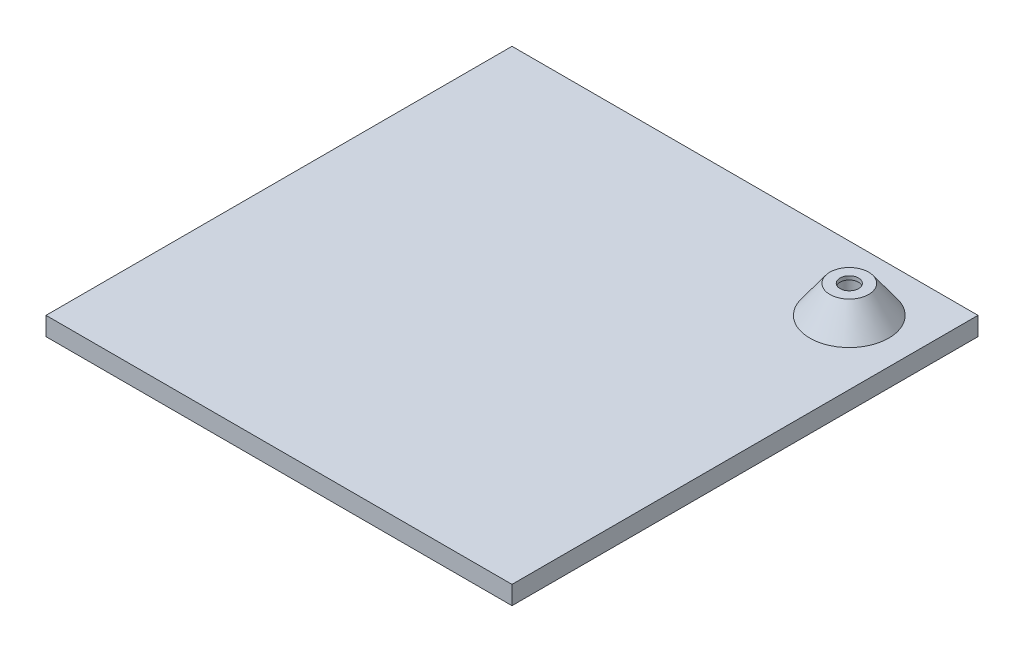
ISO-10303-21;
HEADER;
FILE_DESCRIPTION(('STEP AP214'),'2;1');
FILE_NAME('part.step','',(''),(''),'','','');
FILE_SCHEMA(('AUTOMOTIVE_DESIGN { 1 0 10303 214 1 1 1 1 }'));
ENDSEC;
DATA;
#1=APPLICATION_CONTEXT('core data for automotive mechanical design processes');
#2=APPLICATION_PROTOCOL_DEFINITION('international standard','automotive_design',2000,#1);
#3=PRODUCT_CONTEXT('',#1,'mechanical');
#4=PRODUCT('Part','Part','',(#3));
#5=PRODUCT_RELATED_PRODUCT_CATEGORY('part','',(#4));
#6=PRODUCT_DEFINITION_FORMATION('','',#4);
#7=PRODUCT_DEFINITION_CONTEXT('part definition',#1,'design');
#8=PRODUCT_DEFINITION('design','',#6,#7);
#9=PRODUCT_DEFINITION_SHAPE('','',#8);
#10=(LENGTH_UNIT() NAMED_UNIT(*) SI_UNIT(.MILLI.,.METRE.));
#11=(NAMED_UNIT(*) PLANE_ANGLE_UNIT() SI_UNIT($,.RADIAN.));
#12=(NAMED_UNIT(*) SI_UNIT($,.STERADIAN.) SOLID_ANGLE_UNIT());
#13=UNCERTAINTY_MEASURE_WITH_UNIT(LENGTH_MEASURE(1.E-05),#10,'distance_accuracy_value','');
#14=(GEOMETRIC_REPRESENTATION_CONTEXT(3) GLOBAL_UNCERTAINTY_ASSIGNED_CONTEXT((#13)) GLOBAL_UNIT_ASSIGNED_CONTEXT((#10,
#11,#12)) REPRESENTATION_CONTEXT('',''));
#15=CARTESIAN_POINT('',(0.,0.,0.));
#16=DIRECTION('',(0.,0.,1.));
#17=DIRECTION('',(1.,0.,0.));
#18=AXIS2_PLACEMENT_3D('',#15,#16,#17);
#19=CARTESIAN_POINT('',(0.,5.,0.));
#20=DIRECTION('',(1.,0.,0.));
#21=DIRECTION('',(0.,0.,-1.));
#22=AXIS2_PLACEMENT_3D('',#19,#20,#21);
#23=PLANE('',#22);
#24=DIRECTION('',(0.,0.,1.));
#25=VECTOR('',#24,1.);
#26=CARTESIAN_POINT('',(0.,0.,0.));
#27=LINE('',#26,#25);
#28=CARTESIAN_POINT('',(0.,0.,-126.));
#29=VERTEX_POINT('',#28);
#30=CARTESIAN_POINT('',(0.,0.,0.));
#31=VERTEX_POINT('',#30);
#32=EDGE_CURVE('E115',#29,#31,#27,.T.);
#33=ORIENTED_EDGE('',*,*,#32,.T.);
#34=DIRECTION('',(0.,-1.,0.));
#35=VECTOR('',#34,1.);
#36=CARTESIAN_POINT('',(0.,5.,0.));
#37=LINE('',#36,#35);
#38=CARTESIAN_POINT('',(0.,5.,0.));
#39=VERTEX_POINT('',#38);
#40=EDGE_CURVE('E104',#39,#31,#37,.T.);
#41=ORIENTED_EDGE('',*,*,#40,.F.);
#42=DIRECTION('',(0.,0.,1.));
#43=VECTOR('',#42,1.);
#44=CARTESIAN_POINT('',(0.,5.,0.));
#45=LINE('',#44,#43);
#46=CARTESIAN_POINT('',(0.,5.,-126.));
#47=VERTEX_POINT('',#46);
#48=EDGE_CURVE('E96',#47,#39,#45,.T.);
#49=ORIENTED_EDGE('',*,*,#48,.F.);
#50=DIRECTION('',(0.,-1.,0.));
#51=VECTOR('',#50,1.);
#52=CARTESIAN_POINT('',(0.,5.,-126.));
#53=LINE('',#52,#51);
#54=EDGE_CURVE('E111',#47,#29,#53,.T.);
#55=ORIENTED_EDGE('',*,*,#54,.T.);
#56=EDGE_LOOP('',(#33,#41,#49,#55));
#57=FACE_BOUND('',#56,.T.);
#58=ADVANCED_FACE('F41',(#57),#23,.F.);
#59=CARTESIAN_POINT('',(0.,5.,0.));
#60=DIRECTION('',(0.,0.,-1.));
#61=DIRECTION('',(-1.,0.,0.));
#62=AXIS2_PLACEMENT_3D('',#59,#60,#61);
#63=PLANE('',#62);
#64=DIRECTION('',(1.,0.,0.));
#65=VECTOR('',#64,1.);
#66=CARTESIAN_POINT('',(0.,0.,0.));
#67=LINE('',#66,#65);
#68=CARTESIAN_POINT('',(126.,0.,0.));
#69=VERTEX_POINT('',#68);
#70=EDGE_CURVE('E102',#31,#69,#67,.T.);
#71=ORIENTED_EDGE('',*,*,#70,.T.);
#72=DIRECTION('',(0.,-1.,0.));
#73=VECTOR('',#72,1.);
#74=CARTESIAN_POINT('',(126.,5.,0.));
#75=LINE('',#74,#73);
#76=CARTESIAN_POINT('',(126.,5.,0.));
#77=VERTEX_POINT('',#76);
#78=EDGE_CURVE('E100',#77,#69,#75,.T.);
#79=ORIENTED_EDGE('',*,*,#78,.F.);
#80=DIRECTION('',(1.,0.,0.));
#81=VECTOR('',#80,1.);
#82=CARTESIAN_POINT('',(0.,5.,0.));
#83=LINE('',#82,#81);
#84=EDGE_CURVE('E91',#39,#77,#83,.T.);
#85=ORIENTED_EDGE('',*,*,#84,.F.);
#86=ORIENTED_EDGE('',*,*,#40,.T.);
#87=EDGE_LOOP('',(#71,#79,#85,#86));
#88=FACE_BOUND('',#87,.T.);
#89=ADVANCED_FACE('F101',(#88),#63,.F.);
#90=CARTESIAN_POINT('',(126.,5.,0.));
#91=DIRECTION('',(-1.,0.,0.));
#92=DIRECTION('',(0.,0.,1.));
#93=AXIS2_PLACEMENT_3D('',#90,#91,#92);
#94=PLANE('',#93);
#95=DIRECTION('',(0.,0.,-1.));
#96=VECTOR('',#95,1.);
#97=CARTESIAN_POINT('',(126.,0.,0.));
#98=LINE('',#97,#96);
#99=CARTESIAN_POINT('',(126.,0.,-126.));
#100=VERTEX_POINT('',#99);
#101=EDGE_CURVE('E77',#69,#100,#98,.T.);
#102=ORIENTED_EDGE('',*,*,#101,.T.);
#103=DIRECTION('',(0.,-1.,0.));
#104=VECTOR('',#103,1.);
#105=CARTESIAN_POINT('',(126.,5.,-126.));
#106=LINE('',#105,#104);
#107=CARTESIAN_POINT('',(126.,5.,-126.));
#108=VERTEX_POINT('',#107);
#109=EDGE_CURVE('E105',#108,#100,#106,.T.);
#110=ORIENTED_EDGE('',*,*,#109,.F.);
#111=DIRECTION('',(0.,0.,-1.));
#112=VECTOR('',#111,1.);
#113=CARTESIAN_POINT('',(126.,5.,0.));
#114=LINE('',#113,#112);
#115=EDGE_CURVE('E94',#77,#108,#114,.T.);
#116=ORIENTED_EDGE('',*,*,#115,.F.);
#117=ORIENTED_EDGE('',*,*,#78,.T.);
#118=EDGE_LOOP('',(#102,#110,#116,#117));
#119=FACE_BOUND('',#118,.T.);
#120=ADVANCED_FACE('F107',(#119),#94,.F.);
#121=CARTESIAN_POINT('',(0.,5.,-126.));
#122=DIRECTION('',(0.,0.,1.));
#123=DIRECTION('',(1.,0.,0.));
#124=AXIS2_PLACEMENT_3D('',#121,#122,#123);
#125=PLANE('',#124);
#126=DIRECTION('',(-1.,0.,0.));
#127=VECTOR('',#126,1.);
#128=CARTESIAN_POINT('',(0.,0.,-126.));
#129=LINE('',#128,#127);
#130=EDGE_CURVE('E83',#100,#29,#129,.T.);
#131=ORIENTED_EDGE('',*,*,#130,.T.);
#132=ORIENTED_EDGE('',*,*,#54,.F.);
#133=DIRECTION('',(-1.,0.,0.));
#134=VECTOR('',#133,1.);
#135=CARTESIAN_POINT('',(0.,5.,-126.));
#136=LINE('',#135,#134);
#137=EDGE_CURVE('E60',#108,#47,#136,.T.);
#138=ORIENTED_EDGE('',*,*,#137,.F.);
#139=ORIENTED_EDGE('',*,*,#109,.T.);
#140=EDGE_LOOP('',(#131,#132,#138,#139));
#141=FACE_BOUND('',#140,.T.);
#142=ADVANCED_FACE('F163',(#141),#125,.F.);
#143=CARTESIAN_POINT('',(0.,5.,0.));
#144=DIRECTION('',(0.,-1.,0.));
#145=DIRECTION('',(0.,0.,-1.));
#146=AXIS2_PLACEMENT_3D('',#143,#144,#145);
#147=PLANE('',#146);
#148=CARTESIAN_POINT('',(108.6,5.,-108.6));
#149=DIRECTION('',(0.,-1.,0.));
#150=DIRECTION('',(0.,0.,-1.));
#151=AXIS2_PLACEMENT_3D('',#148,#149,#150);
#152=CIRCLE('',#151,10.6836436799865);
#153=CARTESIAN_POINT('',(108.6,5.,-119.283643679987));
#154=VERTEX_POINT('',#153);
#155=EDGE_CURVE('E11',#154,#154,#152,.T.);
#156=ORIENTED_EDGE('',*,*,#155,.T.);
#157=EDGE_LOOP('',(#156));
#158=FACE_BOUND('',#157,.T.);
#159=ORIENTED_EDGE('',*,*,#48,.T.);
#160=ORIENTED_EDGE('',*,*,#84,.T.);
#161=ORIENTED_EDGE('',*,*,#115,.T.);
#162=ORIENTED_EDGE('',*,*,#137,.T.);
#163=EDGE_LOOP('',(#159,#160,#161,#162));
#164=FACE_BOUND('',#163,.T.);
#165=ADVANCED_FACE('F92',(#158,#164),#147,.F.);
#166=CARTESIAN_POINT('',(0.,0.,0.));
#167=DIRECTION('',(0.,-1.,0.));
#168=DIRECTION('',(0.,0.,-1.));
#169=AXIS2_PLACEMENT_3D('',#166,#167,#168);
#170=PLANE('',#169);
#171=CARTESIAN_POINT('',(108.6,0.,-108.6));
#172=DIRECTION('',(0.,-1.,0.));
#173=DIRECTION('',(0.,0.,-1.));
#174=AXIS2_PLACEMENT_3D('',#171,#172,#173);
#175=CIRCLE('',#174,2.95);
#176=CARTESIAN_POINT('',(108.6,0.,-111.55));
#177=VERTEX_POINT('',#176);
#178=EDGE_CURVE('E135',#177,#177,#175,.T.);
#179=ORIENTED_EDGE('',*,*,#178,.F.);
#180=EDGE_LOOP('',(#179));
#181=FACE_BOUND('',#180,.T.);
#182=ORIENTED_EDGE('',*,*,#32,.F.);
#183=ORIENTED_EDGE('',*,*,#130,.F.);
#184=ORIENTED_EDGE('',*,*,#101,.F.);
#185=ORIENTED_EDGE('',*,*,#70,.F.);
#186=EDGE_LOOP('',(#182,#183,#184,#185));
#187=FACE_BOUND('',#186,.T.);
#188=ADVANCED_FACE('F166',(#181,#187),#170,.T.);
#189=CARTESIAN_POINT('',(108.6,12.5,-108.6));
#190=DIRECTION('',(0.,1.,0.));
#191=DIRECTION('',(0.,0.,1.));
#192=AXIS2_PLACEMENT_3D('',#189,#190,#191);
#193=PLANE('',#192);
#194=CARTESIAN_POINT('',(108.6,12.5,-108.6));
#195=DIRECTION('',(0.,1.,0.));
#196=DIRECTION('',(0.,0.,1.));
#197=AXIS2_PLACEMENT_3D('',#194,#195,#196);
#198=CIRCLE('',#197,5.23457471994626);
#199=CARTESIAN_POINT('',(108.6,12.5,-113.834574719946));
#200=VERTEX_POINT('',#199);
#201=EDGE_CURVE('E52',#200,#200,#198,.T.);
#202=ORIENTED_EDGE('',*,*,#201,.T.);
#203=EDGE_LOOP('',(#202));
#204=FACE_BOUND('',#203,.T.);
#205=CARTESIAN_POINT('',(108.6,12.5,-108.6));
#206=DIRECTION('',(0.,1.,0.));
#207=DIRECTION('',(0.,0.,1.));
#208=AXIS2_PLACEMENT_3D('',#205,#206,#207);
#209=CIRCLE('',#208,2.5);
#210=CARTESIAN_POINT('',(108.6,12.5,-106.1));
#211=VERTEX_POINT('',#210);
#212=EDGE_CURVE('E136',#211,#211,#209,.T.);
#213=ORIENTED_EDGE('',*,*,#212,.F.);
#214=EDGE_LOOP('',(#213));
#215=FACE_BOUND('',#214,.T.);
#216=ADVANCED_FACE('F141',(#204,#215),#193,.T.);
#217=CARTESIAN_POINT('',(108.6,11.5,-108.6));
#218=DIRECTION('',(0.,-1.,0.));
#219=DIRECTION('',(0.,0.,-1.));
#220=AXIS2_PLACEMENT_3D('',#217,#218,#219);
#221=CYLINDRICAL_SURFACE('',#220,2.95);
#222=CARTESIAN_POINT('',(108.6,11.5,-108.6));
#223=DIRECTION('',(0.,-1.,0.));
#224=DIRECTION('',(0.,0.,-1.));
#225=AXIS2_PLACEMENT_3D('',#222,#223,#224);
#226=CIRCLE('',#225,2.95);
#227=CARTESIAN_POINT('',(108.6,11.5,-111.55));
#228=VERTEX_POINT('',#227);
#229=EDGE_CURVE('E119',#228,#228,#226,.T.);
#230=ORIENTED_EDGE('',*,*,#229,.F.);
#231=EDGE_LOOP('',(#230));
#232=FACE_BOUND('',#231,.T.);
#233=ORIENTED_EDGE('',*,*,#178,.T.);
#234=EDGE_LOOP('',(#233));
#235=FACE_BOUND('',#234,.T.);
#236=ADVANCED_FACE('F175',(#232,#235),#221,.F.);
#237=CARTESIAN_POINT('',(108.6,11.5,-108.6));
#238=DIRECTION('',(0.,-1.,0.));
#239=DIRECTION('',(0.,0.,-1.));
#240=AXIS2_PLACEMENT_3D('',#237,#238,#239);
#241=PLANE('',#240);
#242=CARTESIAN_POINT('',(108.6,11.5,-108.6));
#243=DIRECTION('',(0.,-1.,0.));
#244=DIRECTION('',(0.,0.,-1.));
#245=AXIS2_PLACEMENT_3D('',#242,#243,#244);
#246=CIRCLE('',#245,2.5);
#247=CARTESIAN_POINT('',(108.6,11.5,-111.1));
#248=VERTEX_POINT('',#247);
#249=EDGE_CURVE('E132',#248,#248,#246,.T.);
#250=ORIENTED_EDGE('',*,*,#249,.F.);
#251=EDGE_LOOP('',(#250));
#252=FACE_BOUND('',#251,.T.);
#253=ORIENTED_EDGE('',*,*,#229,.T.);
#254=EDGE_LOOP('',(#253));
#255=FACE_BOUND('',#254,.T.);
#256=ADVANCED_FACE('F150',(#252,#255),#241,.T.);
#257=CARTESIAN_POINT('',(108.6,0.,-108.6));
#258=DIRECTION('',(0.,1.,0.));
#259=DIRECTION('',(0.,0.,1.));
#260=AXIS2_PLACEMENT_3D('',#257,#258,#259);
#261=CYLINDRICAL_SURFACE('',#260,2.5);
#262=ORIENTED_EDGE('',*,*,#249,.T.);
#263=EDGE_LOOP('',(#262));
#264=FACE_BOUND('',#263,.T.);
#265=ORIENTED_EDGE('',*,*,#212,.T.);
#266=EDGE_LOOP('',(#265));
#267=FACE_BOUND('',#266,.T.);
#268=ADVANCED_FACE('F145',(#264,#267),#261,.F.);
#269=CARTESIAN_POINT('',(108.6,12.5,-108.6));
#270=DIRECTION('',(0.,-1.,0.));
#271=DIRECTION('',(0.,0.,-1.));
#272=AXIS2_PLACEMENT_3D('',#269,#270,#271);
#273=CONICAL_SURFACE('',#272,5.23457471994626,0.628318530717965);
#274=CARTESIAN_POINT('',(108.6,5.,-119.283643679987));
#275=CARTESIAN_POINT('',(108.6,5.078125,-119.226882544986));
#276=CARTESIAN_POINT('',(108.6,5.15625,-119.170121409986));
#277=CARTESIAN_POINT('',(108.6,5.3125,-119.056599139985));
#278=CARTESIAN_POINT('',(108.6,5.390625,-118.999838004984));
#279=CARTESIAN_POINT('',(108.6,5.546875,-118.886315734984));
#280=CARTESIAN_POINT('',(108.6,5.625,-118.829554599983));
#281=CARTESIAN_POINT('',(108.6,5.78125,-118.716032329982));
#282=CARTESIAN_POINT('',(108.6,5.859375,-118.659271194982));
#283=CARTESIAN_POINT('',(108.6,6.015625,-118.545748924981));
#284=CARTESIAN_POINT('',(108.6,6.09375,-118.488987789981));
#285=CARTESIAN_POINT('',(108.6,6.25,-118.37546551998));
#286=CARTESIAN_POINT('',(108.6,6.328125,-118.318704384979));
#287=CARTESIAN_POINT('',(108.6,6.484375,-118.205182114979));
#288=CARTESIAN_POINT('',(108.6,6.5625,-118.148420979978));
#289=CARTESIAN_POINT('',(108.6,6.71875,-118.034898709977));
#290=CARTESIAN_POINT('',(108.6,6.796875,-117.978137574977));
#291=CARTESIAN_POINT('',(108.6,6.953125,-117.864615304976));
#292=CARTESIAN_POINT('',(108.6,7.03125,-117.807854169976));
#293=CARTESIAN_POINT('',(108.6,7.1875,-117.694331899975));
#294=CARTESIAN_POINT('',(108.6,7.265625,-117.637570764974));
#295=CARTESIAN_POINT('',(108.6,7.421875,-117.524048494974));
#296=CARTESIAN_POINT('',(108.6,7.5,-117.467287359973));
#297=CARTESIAN_POINT('',(108.6,7.65625,-117.353765089972));
#298=CARTESIAN_POINT('',(108.6,7.734375,-117.297003954972));
#299=CARTESIAN_POINT('',(108.6,7.890625,-117.183481684971));
#300=CARTESIAN_POINT('',(108.6,7.96875,-117.126720549971));
#301=CARTESIAN_POINT('',(108.6,8.125,-117.01319827997));
#302=CARTESIAN_POINT('',(108.6,8.203125,-116.956437144969));
#303=CARTESIAN_POINT('',(108.6,8.359375,-116.842914874968));
#304=CARTESIAN_POINT('',(108.6,8.4375,-116.786153739968));
#305=CARTESIAN_POINT('',(108.6,8.59375,-116.672631469967));
#306=CARTESIAN_POINT('',(108.6,8.671875,-116.615870334967));
#307=CARTESIAN_POINT('',(108.6,8.828125,-116.502348064966));
#308=CARTESIAN_POINT('',(108.6,8.90625,-116.445586929966));
#309=CARTESIAN_POINT('',(108.6,9.0625,-116.332064659965));
#310=CARTESIAN_POINT('',(108.6,9.140625,-116.275303524964));
#311=CARTESIAN_POINT('',(108.6,9.296875,-116.161781254963));
#312=CARTESIAN_POINT('',(108.6,9.375,-116.105020119963));
#313=CARTESIAN_POINT('',(108.6,9.53125,-115.991497849962));
#314=CARTESIAN_POINT('',(108.6,9.609375,-115.934736714962));
#315=CARTESIAN_POINT('',(108.6,9.765625,-115.821214444961));
#316=CARTESIAN_POINT('',(108.6,9.84375,-115.764453309961));
#317=CARTESIAN_POINT('',(108.6,10.,-115.65093103996));
#318=CARTESIAN_POINT('',(108.6,10.078125,-115.594169904959));
#319=CARTESIAN_POINT('',(108.6,10.234375,-115.480647634958));
#320=CARTESIAN_POINT('',(108.6,10.3125,-115.423886499958));
#321=CARTESIAN_POINT('',(108.6,10.46875,-115.310364229957));
#322=CARTESIAN_POINT('',(108.6,10.546875,-115.253603094957));
#323=CARTESIAN_POINT('',(108.6,10.703125,-115.140080824956));
#324=CARTESIAN_POINT('',(108.6,10.78125,-115.083319689955));
#325=CARTESIAN_POINT('',(108.6,10.9375,-114.969797419955));
#326=CARTESIAN_POINT('',(108.6,11.015625,-114.913036284954));
#327=CARTESIAN_POINT('',(108.6,11.171875,-114.799514014953));
#328=CARTESIAN_POINT('',(108.6,11.25,-114.742752879953));
#329=CARTESIAN_POINT('',(108.6,11.40625,-114.629230609952));
#330=CARTESIAN_POINT('',(108.6,11.484375,-114.572469474952));
#331=CARTESIAN_POINT('',(108.6,11.640625,-114.458947204951));
#332=CARTESIAN_POINT('',(108.6,11.71875,-114.40218606995));
#333=CARTESIAN_POINT('',(108.6,11.875,-114.28866379995));
#334=CARTESIAN_POINT('',(108.6,11.953125,-114.231902664949));
#335=CARTESIAN_POINT('',(108.6,12.109375,-114.118380394948));
#336=CARTESIAN_POINT('',(108.6,12.1875,-114.061619259948));
#337=CARTESIAN_POINT('',(108.6,12.34375,-113.948096989947));
#338=CARTESIAN_POINT('',(108.6,12.421875,-113.891335854947));
#339=CARTESIAN_POINT('',(108.6,12.5,-113.834574719946));
#340=B_SPLINE_CURVE_WITH_KNOTS('',3,(#274,#275,#276,#277,#278,#279,#280,#281,#282,#283,#284,
#285,#286,#287,#288,#289,#290,#291,#292,#293,#294,#295,#296,#297,#298,#299,#300,#301,#302,#303,
#304,#305,#306,#307,#308,#309,#310,#311,#312,#313,#314,#315,#316,#317,#318,#319,#320,#321,#322,
#323,#324,#325,#326,#327,#328,#329,#330,#331,#332,#333,#334,#335,#336,#337,#338,#339),
.UNSPECIFIED.,.F.,.F.,(4,2,2,2,2,2,2,2,2,2,2,2,2,2,2,2,2,2,2,2,2,2,2,2,2,2,2,2,2,2,2,2,4),(0.,
0.289703432226508,0.579406864453025,0.869110296679541,1.15881372890605,1.44851716113257,
1.73822059335908,2.0279240255856,2.31762745781211,2.60733089003862,2.89703432226514,
3.18673775449166,3.47644118671817,3.76614461894468,4.0558480511712,4.34555148339771,
4.63525491562423,4.92495834785074,5.21466178007725,5.50436521230377,5.79406864453029,
6.0837720767568,6.37347550898331,6.66317894120983,6.95288237343634,7.24258580566286,
7.53228923788937,7.82199267011588,8.1116961023424,8.40139953456892,8.69110296679543,
8.98080639902195,9.27050983124846),.UNSPECIFIED.);
#341=EDGE_CURVE('BSEAM44',#154,#200,#340,.T.);
#342=ORIENTED_EDGE('',*,*,#155,.F.);
#343=ORIENTED_EDGE('',*,*,#201,.F.);
#344=ORIENTED_EDGE('',*,*,#341,.T.);
#345=ORIENTED_EDGE('',*,*,#341,.F.);
#346=EDGE_LOOP('',(#342,#344,#343,#345));
#347=FACE_BOUND('',#346,.T.);
#348=ADVANCED_FACE('F44',(#347),#273,.T.);
#349=CLOSED_SHELL('',(#58,#89,#120,#142,#165,#188,#216,#236,#256,#268,#348));
#350=MANIFOLD_SOLID_BREP('B2',#349);
#351=ADVANCED_BREP_SHAPE_REPRESENTATION('',(#18,#350),#14);
#352=SHAPE_DEFINITION_REPRESENTATION(#9,#351);
ENDSEC;
END-ISO-10303-21;
